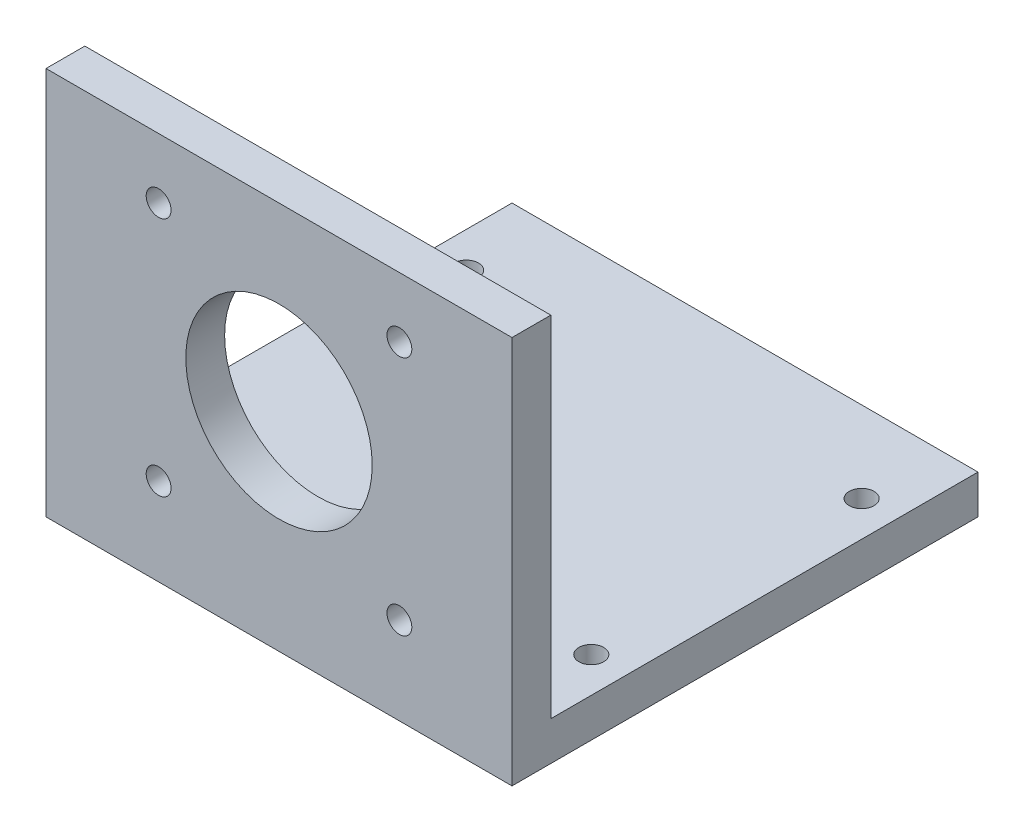
ISO-10303-21;
HEADER;
FILE_DESCRIPTION(('STEP AP214'),'2;1');
FILE_NAME('part.step','',(''),(''),'','','');
FILE_SCHEMA(('AUTOMOTIVE_DESIGN { 1 0 10303 214 1 1 1 1 }'));
ENDSEC;
DATA;
#1=APPLICATION_CONTEXT('core data for automotive mechanical design processes');
#2=APPLICATION_PROTOCOL_DEFINITION('international standard','automotive_design',2000,#1);
#3=PRODUCT_CONTEXT('',#1,'mechanical');
#4=PRODUCT('Part','Part','',(#3));
#5=PRODUCT_RELATED_PRODUCT_CATEGORY('part','',(#4));
#6=PRODUCT_DEFINITION_FORMATION('','',#4);
#7=PRODUCT_DEFINITION_CONTEXT('part definition',#1,'design');
#8=PRODUCT_DEFINITION('design','',#6,#7);
#9=PRODUCT_DEFINITION_SHAPE('','',#8);
#10=(LENGTH_UNIT() NAMED_UNIT(*) SI_UNIT(.MILLI.,.METRE.));
#11=(NAMED_UNIT(*) PLANE_ANGLE_UNIT() SI_UNIT($,.RADIAN.));
#12=(NAMED_UNIT(*) SI_UNIT($,.STERADIAN.) SOLID_ANGLE_UNIT());
#13=UNCERTAINTY_MEASURE_WITH_UNIT(LENGTH_MEASURE(1.E-05),#10,'distance_accuracy_value','');
#14=(GEOMETRIC_REPRESENTATION_CONTEXT(3) GLOBAL_UNCERTAINTY_ASSIGNED_CONTEXT((#13)) GLOBAL_UNIT_ASSIGNED_CONTEXT((#10,
#11,#12)) REPRESENTATION_CONTEXT('',''));
#15=CARTESIAN_POINT('',(0.,0.,0.));
#16=DIRECTION('',(0.,0.,1.));
#17=DIRECTION('',(1.,0.,0.));
#18=AXIS2_PLACEMENT_3D('',#15,#16,#17);
#19=CARTESIAN_POINT('',(60.,5.,-5.));
#20=DIRECTION('',(0.,-1.,0.));
#21=DIRECTION('',(0.,0.,-1.));
#22=AXIS2_PLACEMENT_3D('',#19,#20,#21);
#23=PLANE('',#22);
#24=CARTESIAN_POINT('',(55.4592592592593,5.,-49.5574712643677));
#25=DIRECTION('',(0.,1.,0.));
#26=DIRECTION('',(0.,0.,1.));
#27=AXIS2_PLACEMENT_3D('',#24,#25,#26);
#28=CIRCLE('',#27,1.60000000000002);
#29=CARTESIAN_POINT('',(55.4592592592593,5.,-47.9574712643676));
#30=VERTEX_POINT('',#29);
#31=EDGE_CURVE('E216',#30,#30,#28,.T.);
#32=ORIENTED_EDGE('',*,*,#31,.F.);
#33=EDGE_LOOP('',(#32));
#34=FACE_BOUND('',#33,.T.);
#35=CARTESIAN_POINT('',(4.54074074074073,5.,-14.7490421455937));
#36=DIRECTION('',(0.,1.,0.));
#37=DIRECTION('',(0.,0.,1.));
#38=AXIS2_PLACEMENT_3D('',#35,#36,#37);
#39=CIRCLE('',#38,1.60000000000001);
#40=CARTESIAN_POINT('',(4.54074074074073,5.,-13.1490421455937));
#41=VERTEX_POINT('',#40);
#42=EDGE_CURVE('E220',#41,#41,#39,.T.);
#43=ORIENTED_EDGE('',*,*,#42,.F.);
#44=EDGE_LOOP('',(#43));
#45=FACE_BOUND('',#44,.T.);
#46=CARTESIAN_POINT('',(4.54074074074073,5.,-49.5574712643677));
#47=DIRECTION('',(0.,1.,0.));
#48=DIRECTION('',(0.,0.,1.));
#49=AXIS2_PLACEMENT_3D('',#46,#47,#48);
#50=CIRCLE('',#49,1.60000000000001);
#51=CARTESIAN_POINT('',(4.54074074074073,5.,-47.9574712643676));
#52=VERTEX_POINT('',#51);
#53=EDGE_CURVE('E223',#52,#52,#50,.T.);
#54=ORIENTED_EDGE('',*,*,#53,.F.);
#55=EDGE_LOOP('',(#54));
#56=FACE_BOUND('',#55,.T.);
#57=DIRECTION('',(0.,0.,1.));
#58=VECTOR('',#57,1.);
#59=CARTESIAN_POINT('',(0.,5.,-5.));
#60=LINE('',#59,#58);
#61=CARTESIAN_POINT('',(0.,5.,-60.));
#62=VERTEX_POINT('',#61);
#63=CARTESIAN_POINT('',(0.,5.,-5.));
#64=VERTEX_POINT('',#63);
#65=EDGE_CURVE('E131',#62,#64,#60,.T.);
#66=ORIENTED_EDGE('',*,*,#65,.T.);
#67=DIRECTION('',(-1.,0.,0.));
#68=VECTOR('',#67,1.);
#69=CARTESIAN_POINT('',(60.,5.,-5.));
#70=LINE('',#69,#68);
#71=CARTESIAN_POINT('',(60.,5.,-5.));
#72=VERTEX_POINT('',#71);
#73=EDGE_CURVE('E116',#72,#64,#70,.T.);
#74=ORIENTED_EDGE('',*,*,#73,.F.);
#75=DIRECTION('',(0.,0.,1.));
#76=VECTOR('',#75,1.);
#77=CARTESIAN_POINT('',(60.,5.,-5.));
#78=LINE('',#77,#76);
#79=CARTESIAN_POINT('',(60.,5.,-60.));
#80=VERTEX_POINT('',#79);
#81=EDGE_CURVE('E107',#80,#72,#78,.T.);
#82=ORIENTED_EDGE('',*,*,#81,.F.);
#83=DIRECTION('',(-1.,0.,0.));
#84=VECTOR('',#83,1.);
#85=CARTESIAN_POINT('',(60.,5.,-60.));
#86=LINE('',#85,#84);
#87=EDGE_CURVE('E48',#80,#62,#86,.T.);
#88=ORIENTED_EDGE('',*,*,#87,.T.);
#89=EDGE_LOOP('',(#66,#74,#82,#88));
#90=FACE_BOUND('',#89,.T.);
#91=CARTESIAN_POINT('',(55.4592592592593,5.,-14.7490421455937));
#92=DIRECTION('',(0.,1.,0.));
#93=DIRECTION('',(0.,0.,1.));
#94=AXIS2_PLACEMENT_3D('',#91,#92,#93);
#95=CIRCLE('',#94,1.60000000000002);
#96=CARTESIAN_POINT('',(55.4592592592593,5.,-13.1490421455937));
#97=VERTEX_POINT('',#96);
#98=EDGE_CURVE('E240',#97,#97,#95,.T.);
#99=ORIENTED_EDGE('',*,*,#98,.F.);
#100=EDGE_LOOP('',(#99));
#101=FACE_BOUND('',#100,.T.);
#102=ADVANCED_FACE('F38',(#34,#45,#56,#90,#101),#23,.F.);
#103=CARTESIAN_POINT('',(60.,0.,0.));
#104=DIRECTION('',(0.,0.,-1.));
#105=DIRECTION('',(-1.,0.,0.));
#106=AXIS2_PLACEMENT_3D('',#103,#104,#105);
#107=PLANE('',#106);
#108=CARTESIAN_POINT('',(14.5,42.25,0.));
#109=DIRECTION('',(0.,0.,1.));
#110=DIRECTION('',(1.,0.,0.));
#111=AXIS2_PLACEMENT_3D('',#108,#109,#110);
#112=CIRCLE('',#111,1.60000000000001);
#113=CARTESIAN_POINT('',(16.1,42.25,0.));
#114=VERTEX_POINT('',#113);
#115=EDGE_CURVE('E158',#114,#114,#112,.T.);
#116=ORIENTED_EDGE('',*,*,#115,.F.);
#117=EDGE_LOOP('',(#116));
#118=FACE_BOUND('',#117,.T.);
#119=CARTESIAN_POINT('',(45.5,42.25,0.));
#120=DIRECTION('',(0.,0.,1.));
#121=DIRECTION('',(1.,0.,0.));
#122=AXIS2_PLACEMENT_3D('',#119,#120,#121);
#123=CIRCLE('',#122,1.60000000000001);
#124=CARTESIAN_POINT('',(47.1,42.25,0.));
#125=VERTEX_POINT('',#124);
#126=EDGE_CURVE('E148',#125,#125,#123,.T.);
#127=ORIENTED_EDGE('',*,*,#126,.F.);
#128=EDGE_LOOP('',(#127));
#129=FACE_BOUND('',#128,.T.);
#130=CARTESIAN_POINT('',(45.5,11.25,0.));
#131=DIRECTION('',(0.,0.,1.));
#132=DIRECTION('',(1.,0.,0.));
#133=AXIS2_PLACEMENT_3D('',#130,#131,#132);
#134=CIRCLE('',#133,1.60000000000001);
#135=CARTESIAN_POINT('',(47.1,11.25,0.));
#136=VERTEX_POINT('',#135);
#137=EDGE_CURVE('E145',#136,#136,#134,.T.);
#138=ORIENTED_EDGE('',*,*,#137,.F.);
#139=EDGE_LOOP('',(#138));
#140=FACE_BOUND('',#139,.T.);
#141=CARTESIAN_POINT('',(14.5,11.25,0.));
#142=DIRECTION('',(0.,0.,1.));
#143=DIRECTION('',(1.,0.,0.));
#144=AXIS2_PLACEMENT_3D('',#141,#142,#143);
#145=CIRCLE('',#144,1.60000000000001);
#146=CARTESIAN_POINT('',(16.1,11.25,0.));
#147=VERTEX_POINT('',#146);
#148=EDGE_CURVE('E144',#147,#147,#145,.T.);
#149=ORIENTED_EDGE('',*,*,#148,.F.);
#150=EDGE_LOOP('',(#149));
#151=FACE_BOUND('',#150,.T.);
#152=DIRECTION('',(0.,-1.,0.));
#153=VECTOR('',#152,1.);
#154=CARTESIAN_POINT('',(0.,0.,0.));
#155=LINE('',#154,#153);
#156=CARTESIAN_POINT('',(0.,50.,0.));
#157=VERTEX_POINT('',#156);
#158=CARTESIAN_POINT('',(0.,0.,0.));
#159=VERTEX_POINT('',#158);
#160=EDGE_CURVE('E86',#157,#159,#155,.T.);
#161=ORIENTED_EDGE('',*,*,#160,.T.);
#162=DIRECTION('',(-1.,0.,0.));
#163=VECTOR('',#162,1.);
#164=CARTESIAN_POINT('',(60.,0.,0.));
#165=LINE('',#164,#163);
#166=CARTESIAN_POINT('',(60.,0.,0.));
#167=VERTEX_POINT('',#166);
#168=EDGE_CURVE('E121',#167,#159,#165,.T.);
#169=ORIENTED_EDGE('',*,*,#168,.F.);
#170=DIRECTION('',(0.,-1.,0.));
#171=VECTOR('',#170,1.);
#172=CARTESIAN_POINT('',(60.,0.,0.));
#173=LINE('',#172,#171);
#174=CARTESIAN_POINT('',(60.,50.,0.));
#175=VERTEX_POINT('',#174);
#176=EDGE_CURVE('E57',#175,#167,#173,.T.);
#177=ORIENTED_EDGE('',*,*,#176,.F.);
#178=DIRECTION('',(-1.,0.,0.));
#179=VECTOR('',#178,1.);
#180=CARTESIAN_POINT('',(60.,50.,0.));
#181=LINE('',#180,#179);
#182=EDGE_CURVE('E117',#175,#157,#181,.T.);
#183=ORIENTED_EDGE('',*,*,#182,.T.);
#184=EDGE_LOOP('',(#161,#169,#177,#183));
#185=FACE_BOUND('',#184,.T.);
#186=CARTESIAN_POINT('',(30.,26.75,0.));
#187=DIRECTION('',(0.,0.,1.));
#188=DIRECTION('',(1.,0.,0.));
#189=AXIS2_PLACEMENT_3D('',#186,#187,#188);
#190=CIRCLE('',#189,12.);
#191=CARTESIAN_POINT('',(42.,26.75,0.));
#192=VERTEX_POINT('',#191);
#193=EDGE_CURVE('E167',#192,#192,#190,.T.);
#194=ORIENTED_EDGE('',*,*,#193,.F.);
#195=EDGE_LOOP('',(#194));
#196=FACE_BOUND('',#195,.T.);
#197=ADVANCED_FACE('F183',(#118,#129,#140,#151,#185,#196),#107,.F.);
#198=CARTESIAN_POINT('',(60.,0.,0.));
#199=DIRECTION('',(0.,1.,0.));
#200=DIRECTION('',(0.,0.,1.));
#201=AXIS2_PLACEMENT_3D('',#198,#199,#200);
#202=PLANE('',#201);
#203=CARTESIAN_POINT('',(55.4592592592593,0.,-14.7490421455937));
#204=DIRECTION('',(0.,1.,0.));
#205=DIRECTION('',(0.,0.,1.));
#206=AXIS2_PLACEMENT_3D('',#203,#204,#205);
#207=CIRCLE('',#206,1.60000000000001);
#208=CARTESIAN_POINT('',(55.4592592592593,0.,-13.1490421455937));
#209=VERTEX_POINT('',#208);
#210=EDGE_CURVE('E237',#209,#209,#207,.T.);
#211=ORIENTED_EDGE('',*,*,#210,.T.);
#212=EDGE_LOOP('',(#211));
#213=FACE_BOUND('',#212,.T.);
#214=CARTESIAN_POINT('',(55.4592592592593,0.,-49.5574712643677));
#215=DIRECTION('',(0.,1.,0.));
#216=DIRECTION('',(0.,0.,1.));
#217=AXIS2_PLACEMENT_3D('',#214,#215,#216);
#218=CIRCLE('',#217,1.60000000000001);
#219=CARTESIAN_POINT('',(55.4592592592593,0.,-47.9574712643676));
#220=VERTEX_POINT('',#219);
#221=EDGE_CURVE('E233',#220,#220,#218,.T.);
#222=ORIENTED_EDGE('',*,*,#221,.T.);
#223=EDGE_LOOP('',(#222));
#224=FACE_BOUND('',#223,.T.);
#225=CARTESIAN_POINT('',(4.54074074074073,0.,-14.7490421455937));
#226=DIRECTION('',(0.,1.,0.));
#227=DIRECTION('',(0.,0.,1.));
#228=AXIS2_PLACEMENT_3D('',#225,#226,#227);
#229=CIRCLE('',#228,1.60000000000001);
#230=CARTESIAN_POINT('',(4.54074074074073,0.,-13.1490421455937));
#231=VERTEX_POINT('',#230);
#232=EDGE_CURVE('E226',#231,#231,#229,.T.);
#233=ORIENTED_EDGE('',*,*,#232,.T.);
#234=EDGE_LOOP('',(#233));
#235=FACE_BOUND('',#234,.T.);
#236=CARTESIAN_POINT('',(4.54074074074073,0.,-49.5574712643677));
#237=DIRECTION('',(0.,1.,0.));
#238=DIRECTION('',(0.,0.,1.));
#239=AXIS2_PLACEMENT_3D('',#236,#237,#238);
#240=CIRCLE('',#239,1.60000000000001);
#241=CARTESIAN_POINT('',(4.54074074074073,0.,-47.9574712643676));
#242=VERTEX_POINT('',#241);
#243=EDGE_CURVE('E225',#242,#242,#240,.T.);
#244=ORIENTED_EDGE('',*,*,#243,.T.);
#245=EDGE_LOOP('',(#244));
#246=FACE_BOUND('',#245,.T.);
#247=DIRECTION('',(0.,0.,-1.));
#248=VECTOR('',#247,1.);
#249=CARTESIAN_POINT('',(0.,0.,0.));
#250=LINE('',#249,#248);
#251=CARTESIAN_POINT('',(0.,0.,-60.));
#252=VERTEX_POINT('',#251);
#253=EDGE_CURVE('E125',#159,#252,#250,.T.);
#254=ORIENTED_EDGE('',*,*,#253,.T.);
#255=DIRECTION('',(-1.,0.,0.));
#256=VECTOR('',#255,1.);
#257=CARTESIAN_POINT('',(60.,0.,-60.));
#258=LINE('',#257,#256);
#259=CARTESIAN_POINT('',(60.,0.,-60.));
#260=VERTEX_POINT('',#259);
#261=EDGE_CURVE('E11',#260,#252,#258,.T.);
#262=ORIENTED_EDGE('',*,*,#261,.F.);
#263=DIRECTION('',(0.,0.,-1.));
#264=VECTOR('',#263,1.);
#265=CARTESIAN_POINT('',(60.,0.,0.));
#266=LINE('',#265,#264);
#267=EDGE_CURVE('E136',#167,#260,#266,.T.);
#268=ORIENTED_EDGE('',*,*,#267,.F.);
#269=ORIENTED_EDGE('',*,*,#168,.T.);
#270=EDGE_LOOP('',(#254,#262,#268,#269));
#271=FACE_BOUND('',#270,.T.);
#272=ADVANCED_FACE('F40',(#213,#224,#235,#246,#271),#202,.F.);
#273=CARTESIAN_POINT('',(60.,0.,-60.));
#274=DIRECTION('',(0.,0.,1.));
#275=DIRECTION('',(1.,0.,0.));
#276=AXIS2_PLACEMENT_3D('',#273,#274,#275);
#277=PLANE('',#276);
#278=DIRECTION('',(0.,1.,0.));
#279=VECTOR('',#278,1.);
#280=CARTESIAN_POINT('',(0.,0.,-60.));
#281=LINE('',#280,#279);
#282=EDGE_CURVE('E128',#252,#62,#281,.T.);
#283=ORIENTED_EDGE('',*,*,#282,.T.);
#284=ORIENTED_EDGE('',*,*,#87,.F.);
#285=DIRECTION('',(0.,1.,0.));
#286=VECTOR('',#285,1.);
#287=CARTESIAN_POINT('',(60.,0.,-60.));
#288=LINE('',#287,#286);
#289=EDGE_CURVE('E94',#260,#80,#288,.T.);
#290=ORIENTED_EDGE('',*,*,#289,.F.);
#291=ORIENTED_EDGE('',*,*,#261,.T.);
#292=EDGE_LOOP('',(#283,#284,#290,#291));
#293=FACE_BOUND('',#292,.T.);
#294=ADVANCED_FACE('F175',(#293),#277,.F.);
#295=CARTESIAN_POINT('',(60.,50.,-5.));
#296=DIRECTION('',(0.,0.,1.));
#297=DIRECTION('',(0.,-1.,0.));
#298=AXIS2_PLACEMENT_3D('',#295,#296,#297);
#299=PLANE('',#298);
#300=CARTESIAN_POINT('',(14.5,42.25,-5.));
#301=DIRECTION('',(0.,0.,1.));
#302=DIRECTION('',(0.,-1.,0.));
#303=AXIS2_PLACEMENT_3D('',#300,#301,#302);
#304=CIRCLE('',#303,1.60000000000001);
#305=CARTESIAN_POINT('',(14.5,40.65,-5.));
#306=VERTEX_POINT('',#305);
#307=EDGE_CURVE('E42',#306,#306,#304,.T.);
#308=ORIENTED_EDGE('',*,*,#307,.T.);
#309=EDGE_LOOP('',(#308));
#310=FACE_BOUND('',#309,.T.);
#311=CARTESIAN_POINT('',(45.5,42.25,-5.));
#312=DIRECTION('',(0.,0.,1.));
#313=DIRECTION('',(0.,-1.,0.));
#314=AXIS2_PLACEMENT_3D('',#311,#312,#313);
#315=CIRCLE('',#314,1.60000000000001);
#316=CARTESIAN_POINT('',(45.5,40.65,-5.));
#317=VERTEX_POINT('',#316);
#318=EDGE_CURVE('E146',#317,#317,#315,.T.);
#319=ORIENTED_EDGE('',*,*,#318,.T.);
#320=EDGE_LOOP('',(#319));
#321=FACE_BOUND('',#320,.T.);
#322=CARTESIAN_POINT('',(45.5,11.25,-5.));
#323=DIRECTION('',(0.,0.,1.));
#324=DIRECTION('',(0.,-1.,0.));
#325=AXIS2_PLACEMENT_3D('',#322,#323,#324);
#326=CIRCLE('',#325,1.60000000000001);
#327=CARTESIAN_POINT('',(45.5,9.65000000000002,-5.));
#328=VERTEX_POINT('',#327);
#329=EDGE_CURVE('E142',#328,#328,#326,.T.);
#330=ORIENTED_EDGE('',*,*,#329,.T.);
#331=EDGE_LOOP('',(#330));
#332=FACE_BOUND('',#331,.T.);
#333=CARTESIAN_POINT('',(14.5,11.25,-5.));
#334=DIRECTION('',(0.,0.,1.));
#335=DIRECTION('',(0.,-1.,0.));
#336=AXIS2_PLACEMENT_3D('',#333,#334,#335);
#337=CIRCLE('',#336,1.60000000000001);
#338=CARTESIAN_POINT('',(14.5,9.65000000000002,-5.));
#339=VERTEX_POINT('',#338);
#340=EDGE_CURVE('E164',#339,#339,#337,.T.);
#341=ORIENTED_EDGE('',*,*,#340,.T.);
#342=EDGE_LOOP('',(#341));
#343=FACE_BOUND('',#342,.T.);
#344=CARTESIAN_POINT('',(30.,26.75,-5.));
#345=DIRECTION('',(0.,0.,1.));
#346=DIRECTION('',(0.,-1.,0.));
#347=AXIS2_PLACEMENT_3D('',#344,#345,#346);
#348=CIRCLE('',#347,12.);
#349=CARTESIAN_POINT('',(30.,14.75,-5.));
#350=VERTEX_POINT('',#349);
#351=EDGE_CURVE('E129',#350,#350,#348,.T.);
#352=ORIENTED_EDGE('',*,*,#351,.T.);
#353=EDGE_LOOP('',(#352));
#354=FACE_BOUND('',#353,.T.);
#355=DIRECTION('',(0.,1.,0.));
#356=VECTOR('',#355,1.);
#357=CARTESIAN_POINT('',(0.,50.,-5.));
#358=LINE('',#357,#356);
#359=CARTESIAN_POINT('',(0.,50.,-5.));
#360=VERTEX_POINT('',#359);
#361=EDGE_CURVE('E115',#64,#360,#358,.T.);
#362=ORIENTED_EDGE('',*,*,#361,.T.);
#363=DIRECTION('',(-1.,0.,0.));
#364=VECTOR('',#363,1.);
#365=CARTESIAN_POINT('',(60.,50.,-5.));
#366=LINE('',#365,#364);
#367=CARTESIAN_POINT('',(60.,50.,-5.));
#368=VERTEX_POINT('',#367);
#369=EDGE_CURVE('E112',#368,#360,#366,.T.);
#370=ORIENTED_EDGE('',*,*,#369,.F.);
#371=DIRECTION('',(0.,1.,0.));
#372=VECTOR('',#371,1.);
#373=CARTESIAN_POINT('',(60.,50.,-5.));
#374=LINE('',#373,#372);
#375=EDGE_CURVE('E101',#72,#368,#374,.T.);
#376=ORIENTED_EDGE('',*,*,#375,.F.);
#377=ORIENTED_EDGE('',*,*,#73,.T.);
#378=EDGE_LOOP('',(#362,#370,#376,#377));
#379=FACE_BOUND('',#378,.T.);
#380=ADVANCED_FACE('F113',(#310,#321,#332,#343,#354,#379),#299,.F.);
#381=CARTESIAN_POINT('',(60.,50.,0.));
#382=DIRECTION('',(0.,-1.,0.));
#383=DIRECTION('',(0.,0.,-1.));
#384=AXIS2_PLACEMENT_3D('',#381,#382,#383);
#385=PLANE('',#384);
#386=DIRECTION('',(0.,0.,1.));
#387=VECTOR('',#386,1.);
#388=CARTESIAN_POINT('',(0.,50.,0.));
#389=LINE('',#388,#387);
#390=EDGE_CURVE('E80',#360,#157,#389,.T.);
#391=ORIENTED_EDGE('',*,*,#390,.T.);
#392=ORIENTED_EDGE('',*,*,#182,.F.);
#393=DIRECTION('',(0.,0.,1.));
#394=VECTOR('',#393,1.);
#395=CARTESIAN_POINT('',(60.,50.,0.));
#396=LINE('',#395,#394);
#397=EDGE_CURVE('E105',#368,#175,#396,.T.);
#398=ORIENTED_EDGE('',*,*,#397,.F.);
#399=ORIENTED_EDGE('',*,*,#369,.T.);
#400=EDGE_LOOP('',(#391,#392,#398,#399));
#401=FACE_BOUND('',#400,.T.);
#402=ADVANCED_FACE('F119',(#401),#385,.F.);
#403=CARTESIAN_POINT('',(60.,0.,0.));
#404=DIRECTION('',(1.,0.,0.));
#405=DIRECTION('',(0.,0.,-1.));
#406=AXIS2_PLACEMENT_3D('',#403,#404,#405);
#407=PLANE('',#406);
#408=ORIENTED_EDGE('',*,*,#267,.T.);
#409=ORIENTED_EDGE('',*,*,#289,.T.);
#410=ORIENTED_EDGE('',*,*,#81,.T.);
#411=ORIENTED_EDGE('',*,*,#375,.T.);
#412=ORIENTED_EDGE('',*,*,#397,.T.);
#413=ORIENTED_EDGE('',*,*,#176,.T.);
#414=EDGE_LOOP('',(#408,#409,#410,#411,#412,#413));
#415=FACE_BOUND('',#414,.T.);
#416=ADVANCED_FACE('F103',(#415),#407,.T.);
#417=CARTESIAN_POINT('',(0.,0.,0.));
#418=DIRECTION('',(1.,0.,0.));
#419=DIRECTION('',(0.,0.,-1.));
#420=AXIS2_PLACEMENT_3D('',#417,#418,#419);
#421=PLANE('',#420);
#422=ORIENTED_EDGE('',*,*,#253,.F.);
#423=ORIENTED_EDGE('',*,*,#160,.F.);
#424=ORIENTED_EDGE('',*,*,#390,.F.);
#425=ORIENTED_EDGE('',*,*,#361,.F.);
#426=ORIENTED_EDGE('',*,*,#65,.F.);
#427=ORIENTED_EDGE('',*,*,#282,.F.);
#428=EDGE_LOOP('',(#422,#423,#424,#425,#426,#427));
#429=FACE_BOUND('',#428,.T.);
#430=ADVANCED_FACE('F181',(#429),#421,.F.);
#431=CARTESIAN_POINT('',(30.,26.75,0.));
#432=DIRECTION('',(0.,0.,1.));
#433=DIRECTION('',(1.,0.,0.));
#434=AXIS2_PLACEMENT_3D('',#431,#432,#433);
#435=CYLINDRICAL_SURFACE('',#434,12.);
#436=ORIENTED_EDGE('',*,*,#193,.T.);
#437=EDGE_LOOP('',(#436));
#438=FACE_BOUND('',#437,.T.);
#439=ORIENTED_EDGE('',*,*,#351,.F.);
#440=EDGE_LOOP('',(#439));
#441=FACE_BOUND('',#440,.T.);
#442=ADVANCED_FACE('F190',(#438,#441),#435,.F.);
#443=CARTESIAN_POINT('',(14.5,11.25,0.));
#444=DIRECTION('',(0.,0.,1.));
#445=DIRECTION('',(1.,0.,0.));
#446=AXIS2_PLACEMENT_3D('',#443,#444,#445);
#447=CYLINDRICAL_SURFACE('',#446,1.60000000000001);
#448=ORIENTED_EDGE('',*,*,#148,.T.);
#449=EDGE_LOOP('',(#448));
#450=FACE_BOUND('',#449,.T.);
#451=ORIENTED_EDGE('',*,*,#340,.F.);
#452=EDGE_LOOP('',(#451));
#453=FACE_BOUND('',#452,.T.);
#454=ADVANCED_FACE('F193',(#450,#453),#447,.F.);
#455=CARTESIAN_POINT('',(45.5,11.25,0.));
#456=DIRECTION('',(0.,0.,1.));
#457=DIRECTION('',(1.,0.,0.));
#458=AXIS2_PLACEMENT_3D('',#455,#456,#457);
#459=CYLINDRICAL_SURFACE('',#458,1.60000000000001);
#460=ORIENTED_EDGE('',*,*,#137,.T.);
#461=EDGE_LOOP('',(#460));
#462=FACE_BOUND('',#461,.T.);
#463=ORIENTED_EDGE('',*,*,#329,.F.);
#464=EDGE_LOOP('',(#463));
#465=FACE_BOUND('',#464,.T.);
#466=ADVANCED_FACE('F271',(#462,#465),#459,.F.);
#467=CARTESIAN_POINT('',(45.5,42.25,0.));
#468=DIRECTION('',(0.,0.,1.));
#469=DIRECTION('',(1.,0.,0.));
#470=AXIS2_PLACEMENT_3D('',#467,#468,#469);
#471=CYLINDRICAL_SURFACE('',#470,1.60000000000001);
#472=ORIENTED_EDGE('',*,*,#126,.T.);
#473=EDGE_LOOP('',(#472));
#474=FACE_BOUND('',#473,.T.);
#475=ORIENTED_EDGE('',*,*,#318,.F.);
#476=EDGE_LOOP('',(#475));
#477=FACE_BOUND('',#476,.T.);
#478=ADVANCED_FACE('F267',(#474,#477),#471,.F.);
#479=CARTESIAN_POINT('',(14.5,42.25,0.));
#480=DIRECTION('',(0.,0.,1.));
#481=DIRECTION('',(1.,0.,0.));
#482=AXIS2_PLACEMENT_3D('',#479,#480,#481);
#483=CYLINDRICAL_SURFACE('',#482,1.60000000000001);
#484=ORIENTED_EDGE('',*,*,#115,.T.);
#485=EDGE_LOOP('',(#484));
#486=FACE_BOUND('',#485,.T.);
#487=ORIENTED_EDGE('',*,*,#307,.F.);
#488=EDGE_LOOP('',(#487));
#489=FACE_BOUND('',#488,.T.);
#490=ADVANCED_FACE('F263',(#486,#489),#483,.F.);
#491=CARTESIAN_POINT('',(4.54074074074073,5.,-49.5574712643677));
#492=DIRECTION('',(0.,1.,0.));
#493=DIRECTION('',(0.,0.,1.));
#494=AXIS2_PLACEMENT_3D('',#491,#492,#493);
#495=CYLINDRICAL_SURFACE('',#494,1.60000000000001);
#496=ORIENTED_EDGE('',*,*,#243,.F.);
#497=EDGE_LOOP('',(#496));
#498=FACE_BOUND('',#497,.T.);
#499=ORIENTED_EDGE('',*,*,#53,.T.);
#500=EDGE_LOOP('',(#499));
#501=FACE_BOUND('',#500,.T.);
#502=ADVANCED_FACE('F259',(#498,#501),#495,.F.);
#503=CARTESIAN_POINT('',(4.54074074074073,5.,-14.7490421455937));
#504=DIRECTION('',(0.,1.,0.));
#505=DIRECTION('',(0.,0.,1.));
#506=AXIS2_PLACEMENT_3D('',#503,#504,#505);
#507=CYLINDRICAL_SURFACE('',#506,1.60000000000001);
#508=ORIENTED_EDGE('',*,*,#232,.F.);
#509=EDGE_LOOP('',(#508));
#510=FACE_BOUND('',#509,.T.);
#511=ORIENTED_EDGE('',*,*,#42,.T.);
#512=EDGE_LOOP('',(#511));
#513=FACE_BOUND('',#512,.T.);
#514=ADVANCED_FACE('F252',(#510,#513),#507,.F.);
#515=CARTESIAN_POINT('',(55.4592592592593,5.,-49.5574712643677));
#516=DIRECTION('',(0.,1.,0.));
#517=DIRECTION('',(0.,0.,1.));
#518=AXIS2_PLACEMENT_3D('',#515,#516,#517);
#519=CYLINDRICAL_SURFACE('',#518,1.60000000000001);
#520=ORIENTED_EDGE('',*,*,#221,.F.);
#521=EDGE_LOOP('',(#520));
#522=FACE_BOUND('',#521,.T.);
#523=ORIENTED_EDGE('',*,*,#31,.T.);
#524=EDGE_LOOP('',(#523));
#525=FACE_BOUND('',#524,.T.);
#526=ADVANCED_FACE('F246',(#522,#525),#519,.F.);
#527=CARTESIAN_POINT('',(55.4592592592593,5.,-14.7490421455937));
#528=DIRECTION('',(0.,1.,0.));
#529=DIRECTION('',(0.,0.,1.));
#530=AXIS2_PLACEMENT_3D('',#527,#528,#529);
#531=CYLINDRICAL_SURFACE('',#530,1.60000000000001);
#532=ORIENTED_EDGE('',*,*,#210,.F.);
#533=EDGE_LOOP('',(#532));
#534=FACE_BOUND('',#533,.T.);
#535=ORIENTED_EDGE('',*,*,#98,.T.);
#536=EDGE_LOOP('',(#535));
#537=FACE_BOUND('',#536,.T.);
#538=ADVANCED_FACE('F244',(#534,#537),#531,.F.);
#539=CLOSED_SHELL('',(#102,#197,#272,#294,#380,#402,#416,#430,#442,#454,#466,#478,#490,#502,
#514,#526,#538));
#540=MANIFOLD_SOLID_BREP('B2',#539);
#541=ADVANCED_BREP_SHAPE_REPRESENTATION('',(#18,#540),#14);
#542=SHAPE_DEFINITION_REPRESENTATION(#9,#541);
ENDSEC;
END-ISO-10303-21;
